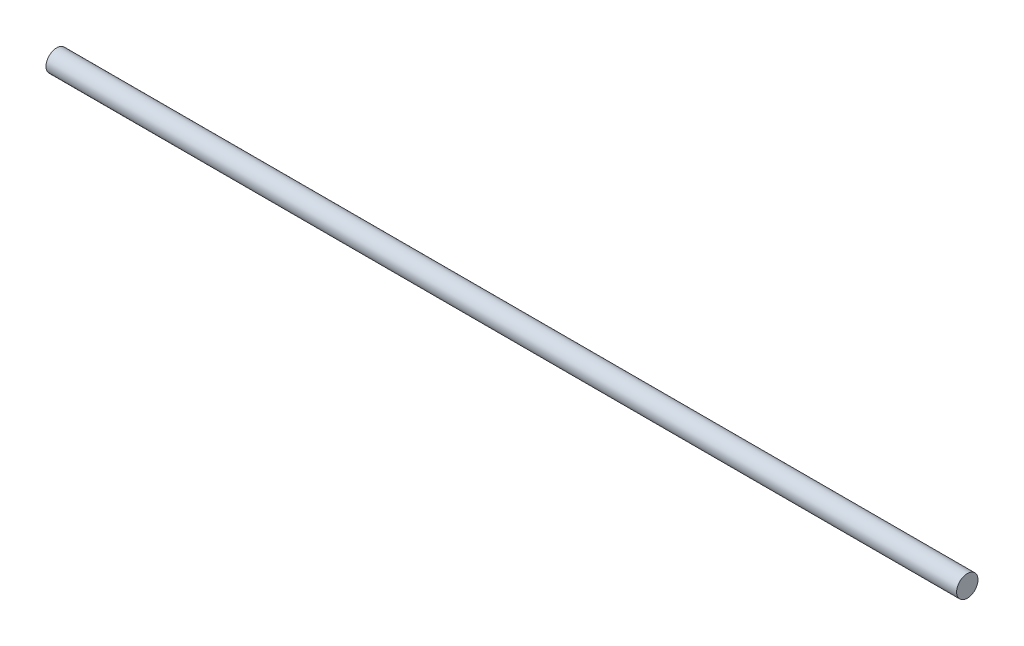
ISO-10303-21;
HEADER;
FILE_DESCRIPTION(('STEP AP214'),'2;1');
FILE_NAME('part.step','',(''),(''),'','','');
FILE_SCHEMA(('AUTOMOTIVE_DESIGN { 1 0 10303 214 1 1 1 1 }'));
ENDSEC;
DATA;
#1=APPLICATION_CONTEXT('core data for automotive mechanical design processes');
#2=APPLICATION_PROTOCOL_DEFINITION('international standard','automotive_design',2000,#1);
#3=PRODUCT_CONTEXT('',#1,'mechanical');
#4=PRODUCT('Part','Part','',(#3));
#5=PRODUCT_RELATED_PRODUCT_CATEGORY('part','',(#4));
#6=PRODUCT_DEFINITION_FORMATION('','',#4);
#7=PRODUCT_DEFINITION_CONTEXT('part definition',#1,'design');
#8=PRODUCT_DEFINITION('design','',#6,#7);
#9=PRODUCT_DEFINITION_SHAPE('','',#8);
#10=(LENGTH_UNIT() NAMED_UNIT(*) SI_UNIT(.MILLI.,.METRE.));
#11=(NAMED_UNIT(*) PLANE_ANGLE_UNIT() SI_UNIT($,.RADIAN.));
#12=(NAMED_UNIT(*) SI_UNIT($,.STERADIAN.) SOLID_ANGLE_UNIT());
#13=UNCERTAINTY_MEASURE_WITH_UNIT(LENGTH_MEASURE(1.E-05),#10,'distance_accuracy_value','');
#14=(GEOMETRIC_REPRESENTATION_CONTEXT(3) GLOBAL_UNCERTAINTY_ASSIGNED_CONTEXT((#13)) GLOBAL_UNIT_ASSIGNED_CONTEXT((#10,
#11,#12)) REPRESENTATION_CONTEXT('',''));
#15=CARTESIAN_POINT('',(0.,0.,0.));
#16=DIRECTION('',(0.,0.,1.));
#17=DIRECTION('',(1.,0.,0.));
#18=AXIS2_PLACEMENT_3D('',#15,#16,#17);
#19=CARTESIAN_POINT('',(762.,0.,0.));
#20=DIRECTION('',(-1.,0.,0.));
#21=DIRECTION('',(0.,0.,1.));
#22=AXIS2_PLACEMENT_3D('',#19,#20,#21);
#23=CYLINDRICAL_SURFACE('',#22,17.907);
#24=CARTESIAN_POINT('',(762.,0.,0.));
#25=DIRECTION('',(1.,0.,0.));
#26=DIRECTION('',(0.,0.,-1.));
#27=AXIS2_PLACEMENT_3D('',#24,#25,#26);
#28=CIRCLE('',#27,17.907);
#29=CARTESIAN_POINT('',(762.,0.,-17.907));
#30=VERTEX_POINT('',#29);
#31=EDGE_CURVE('E10',#30,#30,#28,.T.);
#32=ORIENTED_EDGE('',*,*,#31,.F.);
#33=EDGE_LOOP('',(#32));
#34=FACE_BOUND('',#33,.T.);
#35=CARTESIAN_POINT('',(-762.,0.,0.));
#36=DIRECTION('',(1.,0.,0.));
#37=DIRECTION('',(0.,0.,-1.));
#38=AXIS2_PLACEMENT_3D('',#35,#36,#37);
#39=CIRCLE('',#38,17.907);
#40=CARTESIAN_POINT('',(-762.,0.,-17.907));
#41=VERTEX_POINT('',#40);
#42=EDGE_CURVE('E37',#41,#41,#39,.T.);
#43=ORIENTED_EDGE('',*,*,#42,.T.);
#44=EDGE_LOOP('',(#43));
#45=FACE_BOUND('',#44,.T.);
#46=ADVANCED_FACE('F34',(#34,#45),#23,.T.);
#47=CARTESIAN_POINT('',(762.,0.,0.));
#48=DIRECTION('',(1.,0.,0.));
#49=DIRECTION('',(0.,0.,-1.));
#50=AXIS2_PLACEMENT_3D('',#47,#48,#49);
#51=PLANE('',#50);
#52=ORIENTED_EDGE('',*,*,#31,.T.);
#53=EDGE_LOOP('',(#52));
#54=FACE_BOUND('',#53,.T.);
#55=ADVANCED_FACE('F49',(#54),#51,.T.);
#56=CARTESIAN_POINT('',(-762.,0.,0.));
#57=DIRECTION('',(1.,0.,0.));
#58=DIRECTION('',(0.,0.,-1.));
#59=AXIS2_PLACEMENT_3D('',#56,#57,#58);
#60=PLANE('',#59);
#61=ORIENTED_EDGE('',*,*,#42,.F.);
#62=EDGE_LOOP('',(#61));
#63=FACE_BOUND('',#62,.T.);
#64=ADVANCED_FACE('F47',(#63),#60,.F.);
#65=CLOSED_SHELL('',(#46,#55,#64));
#66=MANIFOLD_SOLID_BREP('B2',#65);
#67=ADVANCED_BREP_SHAPE_REPRESENTATION('',(#18,#66),#14);
#68=SHAPE_DEFINITION_REPRESENTATION(#9,#67);
ENDSEC;
END-ISO-10303-21;
